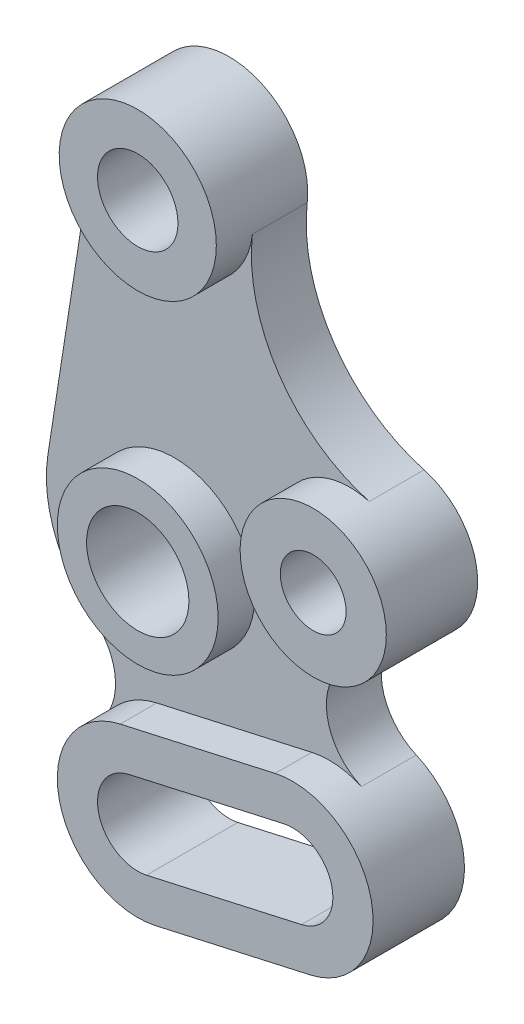
ISO-10303-21;
HEADER;
FILE_DESCRIPTION(('STEP AP214'),'2;1');
FILE_NAME('part.step','',(''),(''),'','','');
FILE_SCHEMA(('AUTOMOTIVE_DESIGN { 1 0 10303 214 1 1 1 1 }'));
ENDSEC;
DATA;
#1=APPLICATION_CONTEXT('core data for automotive mechanical design processes');
#2=APPLICATION_PROTOCOL_DEFINITION('international standard','automotive_design',2000,#1);
#3=PRODUCT_CONTEXT('',#1,'mechanical');
#4=PRODUCT('Part','Part','',(#3));
#5=PRODUCT_RELATED_PRODUCT_CATEGORY('part','',(#4));
#6=PRODUCT_DEFINITION_FORMATION('','',#4);
#7=PRODUCT_DEFINITION_CONTEXT('part definition',#1,'design');
#8=PRODUCT_DEFINITION('design','',#6,#7);
#9=PRODUCT_DEFINITION_SHAPE('','',#8);
#10=(LENGTH_UNIT() NAMED_UNIT(*) SI_UNIT(.MILLI.,.METRE.));
#11=(NAMED_UNIT(*) PLANE_ANGLE_UNIT() SI_UNIT($,.RADIAN.));
#12=(NAMED_UNIT(*) SI_UNIT($,.STERADIAN.) SOLID_ANGLE_UNIT());
#13=UNCERTAINTY_MEASURE_WITH_UNIT(LENGTH_MEASURE(1.E-05),#10,'distance_accuracy_value','');
#14=(GEOMETRIC_REPRESENTATION_CONTEXT(3) GLOBAL_UNCERTAINTY_ASSIGNED_CONTEXT((#13)) GLOBAL_UNIT_ASSIGNED_CONTEXT((#10,
#11,#12)) REPRESENTATION_CONTEXT('',''));
#15=CARTESIAN_POINT('',(0.,0.,0.));
#16=DIRECTION('',(0.,0.,1.));
#17=DIRECTION('',(1.,0.,0.));
#18=AXIS2_PLACEMENT_3D('',#15,#16,#17);
#19=CARTESIAN_POINT('',(130.178529048319,161.352454990135,30.));
#20=DIRECTION('',(0.,0.,-1.));
#21=DIRECTION('',(-1.,0.,0.));
#22=AXIS2_PLACEMENT_3D('',#19,#20,#21);
#23=CYLINDRICAL_SURFACE('',#22,88.);
#24=CARTESIAN_POINT('',(130.178529048319,161.352454990135,0.));
#25=DIRECTION('',(0.,0.,1.));
#26=DIRECTION('',(1.,0.,0.));
#27=AXIS2_PLACEMENT_3D('',#24,#25,#26);
#28=CIRCLE('',#27,88.);
#29=CARTESIAN_POINT('',(106.6807903276,76.5476421844171,0.));
#30=VERTEX_POINT('',#29);
#31=CARTESIAN_POINT('',(42.7303568631886,171.192027210502,0.));
#32=VERTEX_POINT('',#31);
#33=EDGE_CURVE('E89',#30,#32,#28,.F.);
#34=ORIENTED_EDGE('',*,*,#33,.T.);
#35=DIRECTION('',(0.,0.,-1.));
#36=VECTOR('',#35,1.);
#37=CARTESIAN_POINT('',(42.7303568631886,171.192027210502,30.));
#38=LINE('',#37,#36);
#39=CARTESIAN_POINT('',(42.7303568631886,171.192027210502,30.));
#40=VERTEX_POINT('',#39);
#41=EDGE_CURVE('E45',#40,#32,#38,.T.);
#42=ORIENTED_EDGE('',*,*,#41,.F.);
#43=CARTESIAN_POINT('',(130.178529048319,161.352454990135,30.));
#44=DIRECTION('',(0.,0.,1.));
#45=DIRECTION('',(1.,0.,0.));
#46=AXIS2_PLACEMENT_3D('',#43,#44,#45);
#47=CIRCLE('',#46,88.);
#48=CARTESIAN_POINT('',(106.6807903276,76.5476421844171,30.));
#49=VERTEX_POINT('',#48);
#50=EDGE_CURVE('E340',#49,#40,#47,.F.);
#51=ORIENTED_EDGE('',*,*,#50,.F.);
#52=DIRECTION('',(0.,0.,-1.));
#53=VECTOR('',#52,1.);
#54=CARTESIAN_POINT('',(106.6807903276,76.5476421844171,30.));
#55=LINE('',#54,#53);
#56=EDGE_CURVE('E11',#49,#30,#55,.T.);
#57=ORIENTED_EDGE('',*,*,#56,.T.);
#58=EDGE_LOOP('',(#34,#42,#51,#57));
#59=FACE_BOUND('',#58,.T.);
#60=ADVANCED_FACE('F37',(#59),#23,.F.);
#61=CARTESIAN_POINT('',(-69.171393574581,10.7386363636364,30.));
#62=DIRECTION('',(0.988162765351157,-0.153409090909091,0.));
#63=DIRECTION('',(0.153409090909091,0.988162765351157,0.));
#64=AXIS2_PLACEMENT_3D('',#61,#62,#63);
#65=PLANE('',#64);
#66=DIRECTION('',(-0.153409090909091,-0.988162765351157,0.));
#67=VECTOR('',#66,1.);
#68=CARTESIAN_POINT('',(-69.171393574581,10.7386363636364,0.));
#69=LINE('',#68,#67);
#70=CARTESIAN_POINT('',(-42.4909989100998,182.596590909091,0.));
#71=VERTEX_POINT('',#70);
#72=CARTESIAN_POINT('',(-69.171393574581,10.7386363636364,0.));
#73=VERTEX_POINT('',#72);
#74=EDGE_CURVE('E147',#71,#73,#69,.T.);
#75=ORIENTED_EDGE('',*,*,#74,.T.);
#76=DIRECTION('',(0.,0.,-1.));
#77=VECTOR('',#76,1.);
#78=CARTESIAN_POINT('',(-69.171393574581,10.7386363636364,30.));
#79=LINE('',#78,#77);
#80=CARTESIAN_POINT('',(-69.171393574581,10.7386363636364,30.));
#81=VERTEX_POINT('',#80);
#82=EDGE_CURVE('E127',#81,#73,#79,.T.);
#83=ORIENTED_EDGE('',*,*,#82,.F.);
#84=DIRECTION('',(-0.153409090909091,-0.988162765351157,0.));
#85=VECTOR('',#84,1.);
#86=CARTESIAN_POINT('',(-69.171393574581,10.7386363636364,30.));
#87=LINE('',#86,#85);
#88=CARTESIAN_POINT('',(-42.4909989100998,182.596590909091,30.));
#89=VERTEX_POINT('',#88);
#90=EDGE_CURVE('E183',#89,#81,#87,.T.);
#91=ORIENTED_EDGE('',*,*,#90,.F.);
#92=DIRECTION('',(0.,0.,-1.));
#93=VECTOR('',#92,1.);
#94=CARTESIAN_POINT('',(-42.4909989100998,182.596590909091,30.));
#95=LINE('',#94,#93);
#96=EDGE_CURVE('E130',#89,#71,#95,.T.);
#97=ORIENTED_EDGE('',*,*,#96,.T.);
#98=EDGE_LOOP('',(#75,#83,#91,#97));
#99=FACE_BOUND('',#98,.T.);
#100=ADVANCED_FACE('F172',(#99),#65,.F.);
#101=CARTESIAN_POINT('',(0.,0.,30.));
#102=DIRECTION('',(0.,0.,-1.));
#103=DIRECTION('',(-1.,0.,0.));
#104=AXIS2_PLACEMENT_3D('',#101,#102,#103);
#105=CYLINDRICAL_SURFACE('',#104,70.);
#106=CARTESIAN_POINT('',(0.,0.,0.));
#107=DIRECTION('',(0.,0.,1.));
#108=DIRECTION('',(1.,0.,0.));
#109=AXIS2_PLACEMENT_3D('',#106,#107,#108);
#110=CIRCLE('',#109,70.);
#111=CARTESIAN_POINT('',(-44.0401825058243,-54.4101307189542,0.));
#112=VERTEX_POINT('',#111);
#113=EDGE_CURVE('E118',#73,#112,#110,.T.);
#114=ORIENTED_EDGE('',*,*,#113,.T.);
#115=DIRECTION('',(0.,0.,-1.));
#116=VECTOR('',#115,1.);
#117=CARTESIAN_POINT('',(-44.0401825058243,-54.4101307189542,30.));
#118=LINE('',#117,#116);
#119=CARTESIAN_POINT('',(-44.0401825058243,-54.4101307189542,30.));
#120=VERTEX_POINT('',#119);
#121=EDGE_CURVE('E125',#120,#112,#118,.T.);
#122=ORIENTED_EDGE('',*,*,#121,.F.);
#123=CARTESIAN_POINT('',(0.,0.,30.));
#124=DIRECTION('',(0.,0.,1.));
#125=DIRECTION('',(1.,0.,0.));
#126=AXIS2_PLACEMENT_3D('',#123,#124,#125);
#127=CIRCLE('',#126,70.);
#128=EDGE_CURVE('E344',#81,#120,#127,.T.);
#129=ORIENTED_EDGE('',*,*,#128,.F.);
#130=ORIENTED_EDGE('',*,*,#82,.T.);
#131=EDGE_LOOP('',(#114,#122,#129,#130));
#132=FACE_BOUND('',#131,.T.);
#133=ADVANCED_FACE('F160',(#132),#105,.T.);
#134=CARTESIAN_POINT('',(-64.1728373656297,-79.2833333333333,30.));
#135=DIRECTION('',(0.,0.,-1.));
#136=DIRECTION('',(-1.,0.,0.));
#137=AXIS2_PLACEMENT_3D('',#134,#135,#136);
#138=CYLINDRICAL_SURFACE('',#137,32.);
#139=CARTESIAN_POINT('',(-64.1728373656297,-79.2833333333333,0.));
#140=DIRECTION('',(0.,0.,1.));
#141=DIRECTION('',(1.,0.,0.));
#142=AXIS2_PLACEMENT_3D('',#139,#140,#141);
#143=CIRCLE('',#142,32.);
#144=CARTESIAN_POINT('',(-37.1526953169435,-96.4271929824561,0.));
#145=VERTEX_POINT('',#144);
#146=EDGE_CURVE('E113',#112,#145,#143,.F.);
#147=ORIENTED_EDGE('',*,*,#146,.T.);
#148=DIRECTION('',(0.,0.,-1.));
#149=VECTOR('',#148,1.);
#150=CARTESIAN_POINT('',(-37.1526953169435,-96.4271929824561,30.));
#151=LINE('',#150,#149);
#152=CARTESIAN_POINT('',(-37.1526953169435,-96.4271929824561,30.));
#153=VERTEX_POINT('',#152);
#154=EDGE_CURVE('E123',#153,#145,#151,.T.);
#155=ORIENTED_EDGE('',*,*,#154,.F.);
#156=CARTESIAN_POINT('',(-64.1728373656297,-79.2833333333333,30.));
#157=DIRECTION('',(0.,0.,1.));
#158=DIRECTION('',(1.,0.,0.));
#159=AXIS2_PLACEMENT_3D('',#156,#157,#158);
#160=CIRCLE('',#159,32.);
#161=EDGE_CURVE('E53',#120,#153,#160,.F.);
#162=ORIENTED_EDGE('',*,*,#161,.F.);
#163=ORIENTED_EDGE('',*,*,#121,.T.);
#164=EDGE_LOOP('',(#147,#155,#162,#163));
#165=FACE_BOUND('',#164,.T.);
#166=ADVANCED_FACE('F163',(#165),#138,.F.);
#167=CARTESIAN_POINT('',(115.225422589679,-31.3857559319508,30.));
#168=DIRECTION('',(0.,0.,-1.));
#169=DIRECTION('',(-1.,0.,0.));
#170=AXIS2_PLACEMENT_3D('',#167,#168,#169);
#171=CYLINDRICAL_SURFACE('',#170,32.);
#172=CARTESIAN_POINT('',(115.225422589679,-31.3857559319508,0.));
#173=DIRECTION('',(0.,0.,1.));
#174=DIRECTION('',(1.,0.,0.));
#175=AXIS2_PLACEMENT_3D('',#172,#173,#174);
#176=CIRCLE('',#175,32.);
#177=CARTESIAN_POINT('',(106.6807903276,-0.547642184417132,0.));
#178=VERTEX_POINT('',#177);
#179=CARTESIAN_POINT('',(102.397475744046,-60.7020275183175,0.));
#180=VERTEX_POINT('',#179);
#181=EDGE_CURVE('E86',#178,#180,#176,.T.);
#182=ORIENTED_EDGE('',*,*,#181,.F.);
#183=DIRECTION('',(0.,0.,-1.));
#184=VECTOR('',#183,1.);
#185=CARTESIAN_POINT('',(106.6807903276,-0.547642184417132,30.));
#186=LINE('',#185,#184);
#187=CARTESIAN_POINT('',(106.6807903276,-0.547642184417135,30.));
#188=VERTEX_POINT('',#187);
#189=EDGE_CURVE('E97',#188,#178,#186,.T.);
#190=ORIENTED_EDGE('',*,*,#189,.F.);
#191=CARTESIAN_POINT('',(115.225422589679,-31.3857559319508,30.));
#192=DIRECTION('',(0.,0.,1.));
#193=DIRECTION('',(1.,0.,0.));
#194=AXIS2_PLACEMENT_3D('',#191,#192,#193);
#195=CIRCLE('',#194,32.);
#196=CARTESIAN_POINT('',(102.397475744046,-60.7020275183175,30.));
#197=VERTEX_POINT('',#196);
#198=EDGE_CURVE('E107',#188,#197,#195,.T.);
#199=ORIENTED_EDGE('',*,*,#198,.T.);
#200=DIRECTION('',(0.,0.,-1.));
#201=VECTOR('',#200,1.);
#202=CARTESIAN_POINT('',(102.397475744046,-60.7020275183175,30.));
#203=LINE('',#202,#201);
#204=EDGE_CURVE('E106',#197,#180,#203,.T.);
#205=ORIENTED_EDGE('',*,*,#204,.T.);
#206=EDGE_LOOP('',(#182,#190,#199,#205));
#207=FACE_BOUND('',#206,.T.);
#208=ADVANCED_FACE('F110',(#207),#171,.F.);
#209=CARTESIAN_POINT('',(0.,0.,30.));
#210=DIRECTION('',(0.,0.,1.));
#211=DIRECTION('',(1.,0.,0.));
#212=AXIS2_PLACEMENT_3D('',#209,#210,#211);
#213=PLANE('',#212);
#214=CARTESIAN_POINT('',(0.,0.,30.));
#215=DIRECTION('',(0.,0.,1.));
#216=DIRECTION('',(1.,0.,0.));
#217=AXIS2_PLACEMENT_3D('',#214,#215,#216);
#218=CIRCLE('',#217,44.);
#219=CARTESIAN_POINT('',(44.,0.,30.));
#220=VERTEX_POINT('',#219);
#221=EDGE_CURVE('E112',#220,#220,#218,.T.);
#222=ORIENTED_EDGE('',*,*,#221,.F.);
#223=EDGE_LOOP('',(#222));
#224=FACE_BOUND('',#223,.T.);
#225=CARTESIAN_POINT('',(96.,38.,30.));
#226=DIRECTION('',(0.,0.,1.));
#227=DIRECTION('',(1.,0.,0.));
#228=AXIS2_PLACEMENT_3D('',#225,#226,#227);
#229=CIRCLE('',#228,40.);
#230=EDGE_CURVE('E102',#49,#188,#229,.T.);
#231=ORIENTED_EDGE('',*,*,#230,.F.);
#232=ORIENTED_EDGE('',*,*,#50,.T.);
#233=CARTESIAN_POINT('',(0.,176.,30.));
#234=DIRECTION('',(0.,0.,1.));
#235=DIRECTION('',(1.,0.,0.));
#236=AXIS2_PLACEMENT_3D('',#233,#234,#235);
#237=CIRCLE('',#236,43.);
#238=EDGE_CURVE('E143',#89,#40,#237,.T.);
#239=ORIENTED_EDGE('',*,*,#238,.F.);
#240=ORIENTED_EDGE('',*,*,#90,.T.);
#241=ORIENTED_EDGE('',*,*,#128,.T.);
#242=ORIENTED_EDGE('',*,*,#161,.T.);
#243=CARTESIAN_POINT('',(0.,-120.,30.));
#244=DIRECTION('',(0.,0.,1.));
#245=DIRECTION('',(1.,0.,0.));
#246=AXIS2_PLACEMENT_3D('',#243,#244,#245);
#247=CIRCLE('',#246,44.0000000000001);
#248=CARTESIAN_POINT('',(-9.61866460207591,-77.0642189861093,30.));
#249=VERTEX_POINT('',#248);
#250=EDGE_CURVE('E347',#249,#153,#247,.T.);
#251=ORIENTED_EDGE('',*,*,#250,.F.);
#252=DIRECTION('',(0.975813204861151,0.218606013683543,0.));
#253=VECTOR('',#252,1.);
#254=CARTESIAN_POINT('',(15.9795715756591,-71.3295882798761,30.));
#255=LINE('',#254,#253);
#256=CARTESIAN_POINT('',(75.1403842292247,-58.076119935681,30.));
#257=VERTEX_POINT('',#256);
#258=EDGE_CURVE('E349',#249,#257,#255,.T.);
#259=ORIENTED_EDGE('',*,*,#258,.T.);
#260=CARTESIAN_POINT('',(84.7590488313006,-101.011900949572,30.));
#261=DIRECTION('',(0.,0.,1.));
#262=DIRECTION('',(1.,0.,0.));
#263=AXIS2_PLACEMENT_3D('',#260,#261,#262);
#264=CIRCLE('',#263,44.0000000000001);
#265=EDGE_CURVE('E351',#197,#257,#264,.T.);
#266=ORIENTED_EDGE('',*,*,#265,.F.);
#267=ORIENTED_EDGE('',*,*,#198,.F.);
#268=EDGE_LOOP('',(#231,#232,#239,#240,#241,#242,#251,#259,#266,#267));
#269=FACE_BOUND('',#268,.T.);
#270=ADVANCED_FACE('F170',(#224,#269),#213,.T.);
#271=CARTESIAN_POINT('',(0.,0.,0.));
#272=DIRECTION('',(0.,0.,1.));
#273=DIRECTION('',(1.,0.,0.));
#274=AXIS2_PLACEMENT_3D('',#271,#272,#273);
#275=PLANE('',#274);
#276=ORIENTED_EDGE('',*,*,#181,.T.);
#277=CARTESIAN_POINT('',(84.7590488313006,-101.011900949572,0.));
#278=DIRECTION('',(0.,0.,1.));
#279=DIRECTION('',(1.,0.,0.));
#280=AXIS2_PLACEMENT_3D('',#277,#278,#279);
#281=CIRCLE('',#280,44.0000000000001);
#282=CARTESIAN_POINT('',(94.3777134333765,-143.947681963462,0.));
#283=VERTEX_POINT('',#282);
#284=EDGE_CURVE('E273',#283,#180,#281,.T.);
#285=ORIENTED_EDGE('',*,*,#284,.F.);
#286=DIRECTION('',(0.975813204861151,0.218606013683543,0.));
#287=VECTOR('',#286,1.);
#288=CARTESIAN_POINT('',(35.216900779811,-157.201150307658,0.));
#289=LINE('',#288,#287);
#290=CARTESIAN_POINT('',(9.61866460207592,-162.935781013891,0.));
#291=VERTEX_POINT('',#290);
#292=EDGE_CURVE('E298',#291,#283,#289,.T.);
#293=ORIENTED_EDGE('',*,*,#292,.F.);
#294=CARTESIAN_POINT('',(0.,-120.,0.));
#295=DIRECTION('',(0.,0.,1.));
#296=DIRECTION('',(1.,0.,0.));
#297=AXIS2_PLACEMENT_3D('',#294,#295,#296);
#298=CIRCLE('',#297,44.0000000000001);
#299=EDGE_CURVE('E73',#145,#291,#298,.T.);
#300=ORIENTED_EDGE('',*,*,#299,.F.);
#301=ORIENTED_EDGE('',*,*,#146,.F.);
#302=ORIENTED_EDGE('',*,*,#113,.F.);
#303=ORIENTED_EDGE('',*,*,#74,.F.);
#304=CARTESIAN_POINT('',(0.,176.,0.));
#305=DIRECTION('',(0.,0.,1.));
#306=DIRECTION('',(1.,0.,0.));
#307=AXIS2_PLACEMENT_3D('',#304,#305,#306);
#308=CIRCLE('',#307,43.);
#309=EDGE_CURVE('E140',#32,#71,#308,.T.);
#310=ORIENTED_EDGE('',*,*,#309,.F.);
#311=ORIENTED_EDGE('',*,*,#33,.F.);
#312=CARTESIAN_POINT('',(96.,38.,0.));
#313=DIRECTION('',(0.,0.,1.));
#314=DIRECTION('',(1.,0.,0.));
#315=AXIS2_PLACEMENT_3D('',#312,#313,#314);
#316=CIRCLE('',#315,40.);
#317=EDGE_CURVE('E79',#178,#30,#316,.T.);
#318=ORIENTED_EDGE('',*,*,#317,.F.);
#319=EDGE_LOOP('',(#276,#285,#293,#300,#301,#302,#303,#310,#311,#318));
#320=FACE_BOUND('',#319,.T.);
#321=CARTESIAN_POINT('',(0.,176.,0.));
#322=DIRECTION('',(0.,0.,1.));
#323=DIRECTION('',(1.,0.,0.));
#324=AXIS2_PLACEMENT_3D('',#321,#322,#323);
#325=CIRCLE('',#324,22.);
#326=CARTESIAN_POINT('',(22.,176.,0.));
#327=VERTEX_POINT('',#326);
#328=EDGE_CURVE('E331',#327,#327,#325,.T.);
#329=ORIENTED_EDGE('',*,*,#328,.T.);
#330=EDGE_LOOP('',(#329));
#331=FACE_BOUND('',#330,.T.);
#332=CARTESIAN_POINT('',(96.,38.,0.));
#333=DIRECTION('',(0.,0.,1.));
#334=DIRECTION('',(1.,0.,0.));
#335=AXIS2_PLACEMENT_3D('',#332,#333,#334);
#336=CIRCLE('',#335,18.);
#337=CARTESIAN_POINT('',(114.,38.,0.));
#338=VERTEX_POINT('',#337);
#339=EDGE_CURVE('E93',#338,#338,#336,.T.);
#340=ORIENTED_EDGE('',*,*,#339,.T.);
#341=EDGE_LOOP('',(#340));
#342=FACE_BOUND('',#341,.T.);
#343=CARTESIAN_POINT('',(0.,0.,0.));
#344=DIRECTION('',(0.,0.,1.));
#345=DIRECTION('',(1.,0.,0.));
#346=AXIS2_PLACEMENT_3D('',#343,#344,#345);
#347=CIRCLE('',#346,28.);
#348=CARTESIAN_POINT('',(28.,0.,0.));
#349=VERTEX_POINT('',#348);
#350=EDGE_CURVE('E313',#349,#349,#347,.T.);
#351=ORIENTED_EDGE('',*,*,#350,.T.);
#352=EDGE_LOOP('',(#351));
#353=FACE_BOUND('',#352,.T.);
#354=CARTESIAN_POINT('',(0.,-120.,0.));
#355=DIRECTION('',(0.,0.,1.));
#356=DIRECTION('',(1.,0.,0.));
#357=AXIS2_PLACEMENT_3D('',#354,#355,#356);
#358=CIRCLE('',#357,22.);
#359=CARTESIAN_POINT('',(-4.80933230103794,-98.5321094930547,0.));
#360=VERTEX_POINT('',#359);
#361=CARTESIAN_POINT('',(4.80933230103795,-141.467890506945,0.));
#362=VERTEX_POINT('',#361);
#363=EDGE_CURVE('E253',#360,#362,#358,.T.);
#364=ORIENTED_EDGE('',*,*,#363,.T.);
#365=DIRECTION('',(0.975813204861151,0.218606013683543,0.));
#366=VECTOR('',#365,1.);
#367=CARTESIAN_POINT('',(30.4075684787731,-135.733259800712,0.));
#368=LINE('',#367,#366);
#369=CARTESIAN_POINT('',(89.5683811323385,-122.479791456517,0.));
#370=VERTEX_POINT('',#369);
#371=EDGE_CURVE('E295',#362,#370,#368,.T.);
#372=ORIENTED_EDGE('',*,*,#371,.T.);
#373=CARTESIAN_POINT('',(84.7590488313006,-101.011900949572,0.));
#374=DIRECTION('',(0.,0.,1.));
#375=DIRECTION('',(1.,0.,0.));
#376=AXIS2_PLACEMENT_3D('',#373,#374,#375);
#377=CIRCLE('',#376,22.);
#378=CARTESIAN_POINT('',(79.9497165302627,-79.5440104426264,0.));
#379=VERTEX_POINT('',#378);
#380=EDGE_CURVE('E292',#370,#379,#377,.T.);
#381=ORIENTED_EDGE('',*,*,#380,.T.);
#382=DIRECTION('',(0.975813204861151,0.218606013683543,0.));
#383=VECTOR('',#382,1.);
#384=CARTESIAN_POINT('',(20.7889038766971,-92.7974787868215,0.));
#385=LINE('',#384,#383);
#386=EDGE_CURVE('E290',#360,#379,#385,.T.);
#387=ORIENTED_EDGE('',*,*,#386,.F.);
#388=EDGE_LOOP('',(#364,#372,#381,#387));
#389=FACE_BOUND('',#388,.T.);
#390=ADVANCED_FACE('F81',(#320,#331,#342,#353,#389),#275,.F.);
#391=CARTESIAN_POINT('',(0.,176.,50.));
#392=DIRECTION('',(0.,0.,-1.));
#393=DIRECTION('',(-1.,0.,0.));
#394=AXIS2_PLACEMENT_3D('',#391,#392,#393);
#395=CYLINDRICAL_SURFACE('',#394,43.);
#396=CARTESIAN_POINT('',(0.,176.,50.));
#397=DIRECTION('',(0.,0.,1.));
#398=DIRECTION('',(1.,0.,0.));
#399=AXIS2_PLACEMENT_3D('',#396,#397,#398);
#400=CIRCLE('',#399,43.);
#401=CARTESIAN_POINT('',(43.,176.,50.));
#402=VERTEX_POINT('',#401);
#403=EDGE_CURVE('E148',#402,#402,#400,.T.);
#404=ORIENTED_EDGE('',*,*,#403,.F.);
#405=EDGE_LOOP('',(#404));
#406=FACE_BOUND('',#405,.T.);
#407=ORIENTED_EDGE('',*,*,#238,.T.);
#408=ORIENTED_EDGE('',*,*,#41,.T.);
#409=ORIENTED_EDGE('',*,*,#309,.T.);
#410=ORIENTED_EDGE('',*,*,#96,.F.);
#411=EDGE_LOOP('',(#407,#408,#409,#410));
#412=FACE_BOUND('',#411,.T.);
#413=ADVANCED_FACE('F137',(#406,#412),#395,.T.);
#414=CARTESIAN_POINT('',(0.,176.,50.));
#415=DIRECTION('',(0.,0.,-1.));
#416=DIRECTION('',(-1.,0.,0.));
#417=AXIS2_PLACEMENT_3D('',#414,#415,#416);
#418=CYLINDRICAL_SURFACE('',#417,22.);
#419=CARTESIAN_POINT('',(0.,176.,50.));
#420=DIRECTION('',(0.,0.,1.));
#421=DIRECTION('',(1.,0.,0.));
#422=AXIS2_PLACEMENT_3D('',#419,#420,#421);
#423=CIRCLE('',#422,22.);
#424=CARTESIAN_POINT('',(22.,176.,50.));
#425=VERTEX_POINT('',#424);
#426=EDGE_CURVE('E153',#425,#425,#423,.T.);
#427=ORIENTED_EDGE('',*,*,#426,.T.);
#428=EDGE_LOOP('',(#427));
#429=FACE_BOUND('',#428,.T.);
#430=ORIENTED_EDGE('',*,*,#328,.F.);
#431=EDGE_LOOP('',(#430));
#432=FACE_BOUND('',#431,.T.);
#433=ADVANCED_FACE('F416',(#429,#432),#418,.F.);
#434=CARTESIAN_POINT('',(0.,0.,50.));
#435=DIRECTION('',(0.,0.,1.));
#436=DIRECTION('',(1.,0.,0.));
#437=AXIS2_PLACEMENT_3D('',#434,#435,#436);
#438=PLANE('',#437);
#439=ORIENTED_EDGE('',*,*,#426,.F.);
#440=EDGE_LOOP('',(#439));
#441=FACE_BOUND('',#440,.T.);
#442=ORIENTED_EDGE('',*,*,#403,.T.);
#443=EDGE_LOOP('',(#442));
#444=FACE_BOUND('',#443,.T.);
#445=ADVANCED_FACE('F412',(#441,#444),#438,.T.);
#446=CARTESIAN_POINT('',(96.,38.,50.));
#447=DIRECTION('',(0.,0.,-1.));
#448=DIRECTION('',(-1.,0.,0.));
#449=AXIS2_PLACEMENT_3D('',#446,#447,#448);
#450=CYLINDRICAL_SURFACE('',#449,18.);
#451=CARTESIAN_POINT('',(96.,38.,50.));
#452=DIRECTION('',(0.,0.,1.));
#453=DIRECTION('',(1.,0.,0.));
#454=AXIS2_PLACEMENT_3D('',#451,#452,#453);
#455=CIRCLE('',#454,18.);
#456=CARTESIAN_POINT('',(114.,38.,50.));
#457=VERTEX_POINT('',#456);
#458=EDGE_CURVE('E92',#457,#457,#455,.T.);
#459=ORIENTED_EDGE('',*,*,#458,.T.);
#460=EDGE_LOOP('',(#459));
#461=FACE_BOUND('',#460,.T.);
#462=ORIENTED_EDGE('',*,*,#339,.F.);
#463=EDGE_LOOP('',(#462));
#464=FACE_BOUND('',#463,.T.);
#465=ADVANCED_FACE('F409',(#461,#464),#450,.F.);
#466=CARTESIAN_POINT('',(96.,38.,50.));
#467=DIRECTION('',(0.,0.,-1.));
#468=DIRECTION('',(-1.,0.,0.));
#469=AXIS2_PLACEMENT_3D('',#466,#467,#468);
#470=CYLINDRICAL_SURFACE('',#469,40.);
#471=ORIENTED_EDGE('',*,*,#56,.F.);
#472=ORIENTED_EDGE('',*,*,#230,.T.);
#473=ORIENTED_EDGE('',*,*,#189,.T.);
#474=ORIENTED_EDGE('',*,*,#317,.T.);
#475=EDGE_LOOP('',(#471,#472,#473,#474));
#476=FACE_BOUND('',#475,.T.);
#477=CARTESIAN_POINT('',(96.,38.,50.));
#478=DIRECTION('',(0.,0.,1.));
#479=DIRECTION('',(1.,0.,0.));
#480=AXIS2_PLACEMENT_3D('',#477,#478,#479);
#481=CIRCLE('',#480,40.);
#482=CARTESIAN_POINT('',(136.,38.,50.));
#483=VERTEX_POINT('',#482);
#484=EDGE_CURVE('E328',#483,#483,#481,.T.);
#485=ORIENTED_EDGE('',*,*,#484,.F.);
#486=EDGE_LOOP('',(#485));
#487=FACE_BOUND('',#486,.T.);
#488=ADVANCED_FACE('F98',(#476,#487),#470,.T.);
#489=CARTESIAN_POINT('',(0.,0.,50.));
#490=DIRECTION('',(0.,0.,1.));
#491=DIRECTION('',(1.,0.,0.));
#492=AXIS2_PLACEMENT_3D('',#489,#490,#491);
#493=PLANE('',#492);
#494=ORIENTED_EDGE('',*,*,#458,.F.);
#495=EDGE_LOOP('',(#494));
#496=FACE_BOUND('',#495,.T.);
#497=ORIENTED_EDGE('',*,*,#484,.T.);
#498=EDGE_LOOP('',(#497));
#499=FACE_BOUND('',#498,.T.);
#500=ADVANCED_FACE('F402',(#496,#499),#493,.T.);
#501=CARTESIAN_POINT('',(0.,0.,50.));
#502=DIRECTION('',(0.,0.,-1.));
#503=DIRECTION('',(-1.,0.,0.));
#504=AXIS2_PLACEMENT_3D('',#501,#502,#503);
#505=CYLINDRICAL_SURFACE('',#504,28.);
#506=CARTESIAN_POINT('',(0.,0.,50.));
#507=DIRECTION('',(0.,0.,1.));
#508=DIRECTION('',(1.,0.,0.));
#509=AXIS2_PLACEMENT_3D('',#506,#507,#508);
#510=CIRCLE('',#509,28.);
#511=CARTESIAN_POINT('',(28.,0.,50.));
#512=VERTEX_POINT('',#511);
#513=EDGE_CURVE('E318',#512,#512,#510,.T.);
#514=ORIENTED_EDGE('',*,*,#513,.T.);
#515=EDGE_LOOP('',(#514));
#516=FACE_BOUND('',#515,.T.);
#517=ORIENTED_EDGE('',*,*,#350,.F.);
#518=EDGE_LOOP('',(#517));
#519=FACE_BOUND('',#518,.T.);
#520=ADVANCED_FACE('F398',(#516,#519),#505,.F.);
#521=CARTESIAN_POINT('',(0.,0.,50.));
#522=DIRECTION('',(0.,0.,-1.));
#523=DIRECTION('',(-1.,0.,0.));
#524=AXIS2_PLACEMENT_3D('',#521,#522,#523);
#525=CYLINDRICAL_SURFACE('',#524,44.);
#526=ORIENTED_EDGE('',*,*,#221,.T.);
#527=EDGE_LOOP('',(#526));
#528=FACE_BOUND('',#527,.T.);
#529=CARTESIAN_POINT('',(0.,0.,50.));
#530=DIRECTION('',(0.,0.,1.));
#531=DIRECTION('',(1.,0.,0.));
#532=AXIS2_PLACEMENT_3D('',#529,#530,#531);
#533=CIRCLE('',#532,44.);
#534=CARTESIAN_POINT('',(44.,0.,50.));
#535=VERTEX_POINT('',#534);
#536=EDGE_CURVE('E321',#535,#535,#533,.T.);
#537=ORIENTED_EDGE('',*,*,#536,.F.);
#538=EDGE_LOOP('',(#537));
#539=FACE_BOUND('',#538,.T.);
#540=ADVANCED_FACE('F394',(#528,#539),#525,.T.);
#541=CARTESIAN_POINT('',(0.,0.,50.));
#542=DIRECTION('',(0.,0.,1.));
#543=DIRECTION('',(1.,0.,0.));
#544=AXIS2_PLACEMENT_3D('',#541,#542,#543);
#545=PLANE('',#544);
#546=ORIENTED_EDGE('',*,*,#513,.F.);
#547=EDGE_LOOP('',(#546));
#548=FACE_BOUND('',#547,.T.);
#549=ORIENTED_EDGE('',*,*,#536,.T.);
#550=EDGE_LOOP('',(#549));
#551=FACE_BOUND('',#550,.T.);
#552=ADVANCED_FACE('F391',(#548,#551),#545,.T.);
#553=CARTESIAN_POINT('',(0.,-120.,50.));
#554=DIRECTION('',(0.,0.,-1.));
#555=DIRECTION('',(-1.,0.,0.));
#556=AXIS2_PLACEMENT_3D('',#553,#554,#555);
#557=CYLINDRICAL_SURFACE('',#556,44.0000000000001);
#558=ORIENTED_EDGE('',*,*,#250,.T.);
#559=ORIENTED_EDGE('',*,*,#154,.T.);
#560=ORIENTED_EDGE('',*,*,#299,.T.);
#561=DIRECTION('',(0.,0.,-1.));
#562=VECTOR('',#561,1.);
#563=CARTESIAN_POINT('',(9.61866460207592,-162.935781013891,50.));
#564=LINE('',#563,#562);
#565=CARTESIAN_POINT('',(9.61866460207592,-162.935781013891,50.));
#566=VERTEX_POINT('',#565);
#567=EDGE_CURVE('E257',#566,#291,#564,.T.);
#568=ORIENTED_EDGE('',*,*,#567,.F.);
#569=CARTESIAN_POINT('',(0.,-120.,50.));
#570=DIRECTION('',(0.,0.,1.));
#571=DIRECTION('',(1.,0.,0.));
#572=AXIS2_PLACEMENT_3D('',#569,#570,#571);
#573=CIRCLE('',#572,44.0000000000001);
#574=CARTESIAN_POINT('',(-9.61866460207591,-77.0642189861093,50.));
#575=VERTEX_POINT('',#574);
#576=EDGE_CURVE('E286',#575,#566,#573,.T.);
#577=ORIENTED_EDGE('',*,*,#576,.F.);
#578=DIRECTION('',(0.,0.,-1.));
#579=VECTOR('',#578,1.);
#580=CARTESIAN_POINT('',(-9.61866460207591,-77.0642189861093,50.));
#581=LINE('',#580,#579);
#582=EDGE_CURVE('E304',#575,#249,#581,.T.);
#583=ORIENTED_EDGE('',*,*,#582,.T.);
#584=EDGE_LOOP('',(#558,#559,#560,#568,#577,#583));
#585=FACE_BOUND('',#584,.T.);
#586=ADVANCED_FACE('F361',(#585),#557,.T.);
#587=CARTESIAN_POINT('',(35.216900779811,-157.201150307658,50.));
#588=DIRECTION('',(-0.218606013683543,0.975813204861151,0.));
#589=DIRECTION('',(-0.975813204861151,-0.218606013683543,0.));
#590=AXIS2_PLACEMENT_3D('',#587,#588,#589);
#591=PLANE('',#590);
#592=ORIENTED_EDGE('',*,*,#292,.T.);
#593=DIRECTION('',(0.,0.,-1.));
#594=VECTOR('',#593,1.);
#595=CARTESIAN_POINT('',(94.3777134333765,-143.947681963462,50.));
#596=LINE('',#595,#594);
#597=CARTESIAN_POINT('',(94.3777134333765,-143.947681963462,50.));
#598=VERTEX_POINT('',#597);
#599=EDGE_CURVE('E310',#598,#283,#596,.T.);
#600=ORIENTED_EDGE('',*,*,#599,.F.);
#601=DIRECTION('',(0.975813204861151,0.218606013683543,0.));
#602=VECTOR('',#601,1.);
#603=CARTESIAN_POINT('',(35.216900779811,-157.201150307658,50.));
#604=LINE('',#603,#602);
#605=EDGE_CURVE('E278',#566,#598,#604,.T.);
#606=ORIENTED_EDGE('',*,*,#605,.F.);
#607=ORIENTED_EDGE('',*,*,#567,.T.);
#608=EDGE_LOOP('',(#592,#600,#606,#607));
#609=FACE_BOUND('',#608,.T.);
#610=ADVANCED_FACE('F368',(#609),#591,.F.);
#611=CARTESIAN_POINT('',(84.7590488313006,-101.011900949572,50.));
#612=DIRECTION('',(0.,0.,-1.));
#613=DIRECTION('',(-1.,0.,0.));
#614=AXIS2_PLACEMENT_3D('',#611,#612,#613);
#615=CYLINDRICAL_SURFACE('',#614,44.0000000000001);
#616=ORIENTED_EDGE('',*,*,#204,.F.);
#617=ORIENTED_EDGE('',*,*,#265,.T.);
#618=DIRECTION('',(0.,0.,-1.));
#619=VECTOR('',#618,1.);
#620=CARTESIAN_POINT('',(75.1403842292247,-58.076119935681,50.));
#621=LINE('',#620,#619);
#622=CARTESIAN_POINT('',(75.1403842292247,-58.076119935681,50.));
#623=VERTEX_POINT('',#622);
#624=EDGE_CURVE('E307',#623,#257,#621,.T.);
#625=ORIENTED_EDGE('',*,*,#624,.F.);
#626=CARTESIAN_POINT('',(84.7590488313006,-101.011900949572,50.));
#627=DIRECTION('',(0.,0.,1.));
#628=DIRECTION('',(1.,0.,0.));
#629=AXIS2_PLACEMENT_3D('',#626,#627,#628);
#630=CIRCLE('',#629,44.0000000000001);
#631=EDGE_CURVE('E281',#598,#623,#630,.T.);
#632=ORIENTED_EDGE('',*,*,#631,.F.);
#633=ORIENTED_EDGE('',*,*,#599,.T.);
#634=ORIENTED_EDGE('',*,*,#284,.T.);
#635=EDGE_LOOP('',(#616,#617,#625,#632,#633,#634));
#636=FACE_BOUND('',#635,.T.);
#637=ADVANCED_FACE('F366',(#636),#615,.T.);
#638=CARTESIAN_POINT('',(15.9795715756591,-71.3295882798761,50.));
#639=DIRECTION('',(-0.218606013683543,0.975813204861151,0.));
#640=DIRECTION('',(-0.975813204861151,-0.218606013683543,0.));
#641=AXIS2_PLACEMENT_3D('',#638,#639,#640);
#642=PLANE('',#641);
#643=ORIENTED_EDGE('',*,*,#624,.T.);
#644=ORIENTED_EDGE('',*,*,#258,.F.);
#645=ORIENTED_EDGE('',*,*,#582,.F.);
#646=DIRECTION('',(0.975813204861151,0.218606013683543,0.));
#647=VECTOR('',#646,1.);
#648=CARTESIAN_POINT('',(15.9795715756591,-71.3295882798761,50.));
#649=LINE('',#648,#647);
#650=EDGE_CURVE('E283',#575,#623,#649,.T.);
#651=ORIENTED_EDGE('',*,*,#650,.T.);
#652=EDGE_LOOP('',(#643,#644,#645,#651));
#653=FACE_BOUND('',#652,.T.);
#654=ADVANCED_FACE('F358',(#653),#642,.T.);
#655=CARTESIAN_POINT('',(0.,-120.,50.));
#656=DIRECTION('',(0.,0.,-1.));
#657=DIRECTION('',(-1.,0.,0.));
#658=AXIS2_PLACEMENT_3D('',#655,#656,#657);
#659=CYLINDRICAL_SURFACE('',#658,22.);
#660=ORIENTED_EDGE('',*,*,#363,.F.);
#661=DIRECTION('',(0.,0.,-1.));
#662=VECTOR('',#661,1.);
#663=CARTESIAN_POINT('',(-4.80933230103794,-98.5321094930547,50.));
#664=LINE('',#663,#662);
#665=CARTESIAN_POINT('',(-4.80933230103794,-98.5321094930547,50.));
#666=VERTEX_POINT('',#665);
#667=EDGE_CURVE('E246',#666,#360,#664,.T.);
#668=ORIENTED_EDGE('',*,*,#667,.F.);
#669=CARTESIAN_POINT('',(0.,-120.,50.));
#670=DIRECTION('',(0.,0.,1.));
#671=DIRECTION('',(1.,0.,0.));
#672=AXIS2_PLACEMENT_3D('',#669,#670,#671);
#673=CIRCLE('',#672,22.);
#674=CARTESIAN_POINT('',(4.80933230103795,-141.467890506945,50.));
#675=VERTEX_POINT('',#674);
#676=EDGE_CURVE('E250',#666,#675,#673,.T.);
#677=ORIENTED_EDGE('',*,*,#676,.T.);
#678=DIRECTION('',(0.,0.,-1.));
#679=VECTOR('',#678,1.);
#680=CARTESIAN_POINT('',(4.80933230103795,-141.467890506945,50.));
#681=LINE('',#680,#679);
#682=EDGE_CURVE('E288',#675,#362,#681,.T.);
#683=ORIENTED_EDGE('',*,*,#682,.T.);
#684=EDGE_LOOP('',(#660,#668,#677,#683));
#685=FACE_BOUND('',#684,.T.);
#686=ADVANCED_FACE('F248',(#685),#659,.F.);
#687=CARTESIAN_POINT('',(20.7889038766971,-92.7974787868215,50.));
#688=DIRECTION('',(-0.218606013683543,0.975813204861151,0.));
#689=DIRECTION('',(-0.975813204861151,-0.218606013683543,0.));
#690=AXIS2_PLACEMENT_3D('',#687,#688,#689);
#691=PLANE('',#690);
#692=ORIENTED_EDGE('',*,*,#386,.T.);
#693=DIRECTION('',(0.,0.,-1.));
#694=VECTOR('',#693,1.);
#695=CARTESIAN_POINT('',(79.9497165302627,-79.5440104426264,50.));
#696=LINE('',#695,#694);
#697=CARTESIAN_POINT('',(79.9497165302627,-79.5440104426264,50.));
#698=VERTEX_POINT('',#697);
#699=EDGE_CURVE('E258',#698,#379,#696,.T.);
#700=ORIENTED_EDGE('',*,*,#699,.F.);
#701=DIRECTION('',(0.975813204861151,0.218606013683543,0.));
#702=VECTOR('',#701,1.);
#703=CARTESIAN_POINT('',(20.7889038766971,-92.7974787868215,50.));
#704=LINE('',#703,#702);
#705=EDGE_CURVE('E261',#666,#698,#704,.T.);
#706=ORIENTED_EDGE('',*,*,#705,.F.);
#707=ORIENTED_EDGE('',*,*,#667,.T.);
#708=EDGE_LOOP('',(#692,#700,#706,#707));
#709=FACE_BOUND('',#708,.T.);
#710=ADVANCED_FACE('F262',(#709),#691,.F.);
#711=CARTESIAN_POINT('',(84.7590488313006,-101.011900949572,50.));
#712=DIRECTION('',(0.,0.,-1.));
#713=DIRECTION('',(-1.,0.,0.));
#714=AXIS2_PLACEMENT_3D('',#711,#712,#713);
#715=CYLINDRICAL_SURFACE('',#714,22.);
#716=ORIENTED_EDGE('',*,*,#380,.F.);
#717=DIRECTION('',(0.,0.,-1.));
#718=VECTOR('',#717,1.);
#719=CARTESIAN_POINT('',(89.5683811323385,-122.479791456517,50.));
#720=LINE('',#719,#718);
#721=CARTESIAN_POINT('',(89.5683811323385,-122.479791456517,50.));
#722=VERTEX_POINT('',#721);
#723=EDGE_CURVE('E315',#722,#370,#720,.T.);
#724=ORIENTED_EDGE('',*,*,#723,.F.);
#725=CARTESIAN_POINT('',(84.7590488313006,-101.011900949572,50.));
#726=DIRECTION('',(0.,0.,1.));
#727=DIRECTION('',(1.,0.,0.));
#728=AXIS2_PLACEMENT_3D('',#725,#726,#727);
#729=CIRCLE('',#728,22.);
#730=EDGE_CURVE('E266',#722,#698,#729,.T.);
#731=ORIENTED_EDGE('',*,*,#730,.T.);
#732=ORIENTED_EDGE('',*,*,#699,.T.);
#733=EDGE_LOOP('',(#716,#724,#731,#732));
#734=FACE_BOUND('',#733,.T.);
#735=ADVANCED_FACE('F382',(#734),#715,.F.);
#736=CARTESIAN_POINT('',(30.4075684787731,-135.733259800712,50.));
#737=DIRECTION('',(-0.218606013683543,0.975813204861151,0.));
#738=DIRECTION('',(-0.975813204861151,-0.218606013683543,0.));
#739=AXIS2_PLACEMENT_3D('',#736,#737,#738);
#740=PLANE('',#739);
#741=ORIENTED_EDGE('',*,*,#371,.F.);
#742=ORIENTED_EDGE('',*,*,#682,.F.);
#743=DIRECTION('',(0.975813204861151,0.218606013683543,0.));
#744=VECTOR('',#743,1.);
#745=CARTESIAN_POINT('',(30.4075684787731,-135.733259800712,50.));
#746=LINE('',#745,#744);
#747=EDGE_CURVE('E271',#675,#722,#746,.T.);
#748=ORIENTED_EDGE('',*,*,#747,.T.);
#749=ORIENTED_EDGE('',*,*,#723,.T.);
#750=EDGE_LOOP('',(#741,#742,#748,#749));
#751=FACE_BOUND('',#750,.T.);
#752=ADVANCED_FACE('F379',(#751),#740,.T.);
#753=CARTESIAN_POINT('',(0.,0.,50.));
#754=DIRECTION('',(0.,0.,1.));
#755=DIRECTION('',(1.,0.,0.));
#756=AXIS2_PLACEMENT_3D('',#753,#754,#755);
#757=PLANE('',#756);
#758=ORIENTED_EDGE('',*,*,#676,.F.);
#759=ORIENTED_EDGE('',*,*,#705,.T.);
#760=ORIENTED_EDGE('',*,*,#730,.F.);
#761=ORIENTED_EDGE('',*,*,#747,.F.);
#762=EDGE_LOOP('',(#758,#759,#760,#761));
#763=FACE_BOUND('',#762,.T.);
#764=ORIENTED_EDGE('',*,*,#605,.T.);
#765=ORIENTED_EDGE('',*,*,#631,.T.);
#766=ORIENTED_EDGE('',*,*,#650,.F.);
#767=ORIENTED_EDGE('',*,*,#576,.T.);
#768=EDGE_LOOP('',(#764,#765,#766,#767));
#769=FACE_BOUND('',#768,.T.);
#770=ADVANCED_FACE('F268',(#763,#769),#757,.T.);
#771=CLOSED_SHELL('',(#60,#100,#133,#166,#208,#270,#390,#413,#433,#445,#465,#488,#500,#520,#540,
#552,#586,#610,#637,#654,#686,#710,#735,#752,#770));
#772=MANIFOLD_SOLID_BREP('B2',#771);
#773=ADVANCED_BREP_SHAPE_REPRESENTATION('',(#18,#772),#14);
#774=SHAPE_DEFINITION_REPRESENTATION(#9,#773);
ENDSEC;
END-ISO-10303-21;
